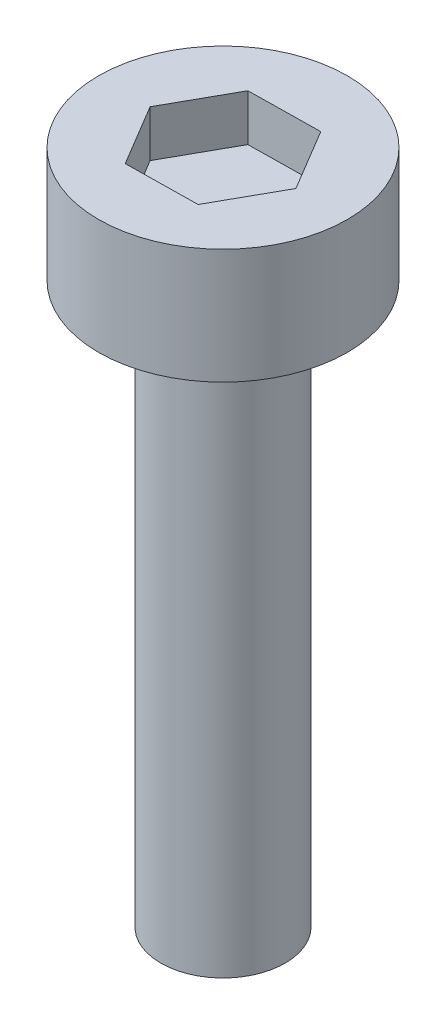
ISO-10303-21;
HEADER;
FILE_DESCRIPTION(('STEP AP214'),'2;1');
FILE_NAME('part.step','',(''),(''),'','','');
FILE_SCHEMA(('AUTOMOTIVE_DESIGN { 1 0 10303 214 1 1 1 1 }'));
ENDSEC;
DATA;
#1=APPLICATION_CONTEXT('core data for automotive mechanical design processes');
#2=APPLICATION_PROTOCOL_DEFINITION('international standard','automotive_design',2000,#1);
#3=PRODUCT_CONTEXT('',#1,'mechanical');
#4=PRODUCT('Part','Part','',(#3));
#5=PRODUCT_RELATED_PRODUCT_CATEGORY('part','',(#4));
#6=PRODUCT_DEFINITION_FORMATION('','',#4);
#7=PRODUCT_DEFINITION_CONTEXT('part definition',#1,'design');
#8=PRODUCT_DEFINITION('design','',#6,#7);
#9=PRODUCT_DEFINITION_SHAPE('','',#8);
#10=(LENGTH_UNIT() NAMED_UNIT(*) SI_UNIT(.MILLI.,.METRE.));
#11=(NAMED_UNIT(*) PLANE_ANGLE_UNIT() SI_UNIT($,.RADIAN.));
#12=(NAMED_UNIT(*) SI_UNIT($,.STERADIAN.) SOLID_ANGLE_UNIT());
#13=UNCERTAINTY_MEASURE_WITH_UNIT(LENGTH_MEASURE(1.E-05),#10,'distance_accuracy_value','');
#14=(GEOMETRIC_REPRESENTATION_CONTEXT(3) GLOBAL_UNCERTAINTY_ASSIGNED_CONTEXT((#13)) GLOBAL_UNIT_ASSIGNED_CONTEXT((#10,
#11,#12)) REPRESENTATION_CONTEXT('',''));
#15=CARTESIAN_POINT('',(0.,0.,0.));
#16=DIRECTION('',(0.,0.,1.));
#17=DIRECTION('',(1.,0.,0.));
#18=AXIS2_PLACEMENT_3D('',#15,#16,#17);
#19=CARTESIAN_POINT('',(0.,18.,0.));
#20=DIRECTION('',(0.,-1.,0.));
#21=DIRECTION('',(0.,0.,-1.));
#22=AXIS2_PLACEMENT_3D('',#19,#20,#21);
#23=CYLINDRICAL_SURFACE('',#22,2.);
#24=CARTESIAN_POINT('',(0.,18.,0.));
#25=DIRECTION('',(0.,1.,0.));
#26=DIRECTION('',(0.,0.,1.));
#27=AXIS2_PLACEMENT_3D('',#24,#25,#26);
#28=CIRCLE('',#27,2.);
#29=CARTESIAN_POINT('',(0.,18.,2.));
#30=VERTEX_POINT('',#29);
#31=EDGE_CURVE('E11',#30,#30,#28,.T.);
#32=ORIENTED_EDGE('',*,*,#31,.F.);
#33=EDGE_LOOP('',(#32));
#34=FACE_BOUND('',#33,.T.);
#35=CARTESIAN_POINT('',(0.,0.,0.));
#36=DIRECTION('',(0.,1.,0.));
#37=DIRECTION('',(0.,0.,1.));
#38=AXIS2_PLACEMENT_3D('',#35,#36,#37);
#39=CIRCLE('',#38,2.);
#40=CARTESIAN_POINT('',(0.,0.,2.));
#41=VERTEX_POINT('',#40);
#42=EDGE_CURVE('E24',#41,#41,#39,.T.);
#43=ORIENTED_EDGE('',*,*,#42,.T.);
#44=EDGE_LOOP('',(#43));
#45=FACE_BOUND('',#44,.T.);
#46=ADVANCED_FACE('F17',(#34,#45),#23,.T.);
#47=CARTESIAN_POINT('',(0.,0.,0.));
#48=DIRECTION('',(0.,1.,0.));
#49=DIRECTION('',(0.,0.,1.));
#50=AXIS2_PLACEMENT_3D('',#47,#48,#49);
#51=PLANE('',#50);
#52=ORIENTED_EDGE('',*,*,#42,.F.);
#53=EDGE_LOOP('',(#52));
#54=FACE_BOUND('',#53,.T.);
#55=ADVANCED_FACE('F132',(#54),#51,.F.);
#56=CARTESIAN_POINT('',(0.,21.7,0.));
#57=DIRECTION('',(0.,-1.,0.));
#58=DIRECTION('',(0.,0.,-1.));
#59=AXIS2_PLACEMENT_3D('',#56,#57,#58);
#60=CYLINDRICAL_SURFACE('',#59,4.);
#61=CARTESIAN_POINT('',(0.,21.7,0.));
#62=DIRECTION('',(0.,1.,0.));
#63=DIRECTION('',(0.,0.,1.));
#64=AXIS2_PLACEMENT_3D('',#61,#62,#63);
#65=CIRCLE('',#64,4.);
#66=CARTESIAN_POINT('',(0.,21.7,4.));
#67=VERTEX_POINT('',#66);
#68=EDGE_CURVE('E126',#67,#67,#65,.T.);
#69=ORIENTED_EDGE('',*,*,#68,.F.);
#70=EDGE_LOOP('',(#69));
#71=FACE_BOUND('',#70,.T.);
#72=CARTESIAN_POINT('',(0.,18.,0.));
#73=DIRECTION('',(0.,1.,0.));
#74=DIRECTION('',(0.,0.,1.));
#75=AXIS2_PLACEMENT_3D('',#72,#73,#74);
#76=CIRCLE('',#75,4.);
#77=CARTESIAN_POINT('',(0.,18.,4.));
#78=VERTEX_POINT('',#77);
#79=EDGE_CURVE('E123',#78,#78,#76,.T.);
#80=ORIENTED_EDGE('',*,*,#79,.T.);
#81=EDGE_LOOP('',(#80));
#82=FACE_BOUND('',#81,.T.);
#83=ADVANCED_FACE('F134',(#71,#82),#60,.T.);
#84=CARTESIAN_POINT('',(0.,21.7,0.));
#85=DIRECTION('',(0.,1.,0.));
#86=DIRECTION('',(0.,0.,1.));
#87=AXIS2_PLACEMENT_3D('',#84,#85,#86);
#88=PLANE('',#87);
#89=DIRECTION('',(0.999893086922528,0.,-0.0146224048821465));
#90=VECTOR('',#89,1.);
#91=CARTESIAN_POINT('',(-1.12533227602684,21.7,2.01667067263487));
#92=LINE('',#91,#90);
#93=CARTESIAN_POINT('',(-1.12533227602684,21.7,2.01667067263487));
#94=VERTEX_POINT('',#93);
#95=CARTESIAN_POINT('',(1.18382189555543,21.7,1.98290167505524));
#96=VERTEX_POINT('',#95);
#97=EDGE_CURVE('E31',#94,#96,#92,.T.);
#98=ORIENTED_EDGE('',*,*,#97,.F.);
#99=DIRECTION('',(0.512609917553624,0.,0.858621611902278));
#100=VECTOR('',#99,1.);
#101=CARTESIAN_POINT('',(-2.30915417158227,21.7,0.0337689975796269));
#102=LINE('',#101,#100);
#103=CARTESIAN_POINT('',(-2.30915417158227,21.7,0.0337689975796269));
#104=VERTEX_POINT('',#103);
#105=EDGE_CURVE('E36',#104,#94,#102,.T.);
#106=ORIENTED_EDGE('',*,*,#105,.F.);
#107=DIRECTION('',(-0.487283169368904,0.,0.873244016784424));
#108=VECTOR('',#107,1.);
#109=CARTESIAN_POINT('',(-1.18382189555543,21.7,-1.98290167505524));
#110=LINE('',#109,#108);
#111=CARTESIAN_POINT('',(-1.18382189555543,21.7,-1.98290167505524));
#112=VERTEX_POINT('',#111);
#113=EDGE_CURVE('E118',#112,#104,#110,.T.);
#114=ORIENTED_EDGE('',*,*,#113,.F.);
#115=DIRECTION('',(-0.999893086922528,0.,0.0146224048821459));
#116=VECTOR('',#115,1.);
#117=CARTESIAN_POINT('',(1.12533227602684,21.7,-2.01667067263487));
#118=LINE('',#117,#116);
#119=CARTESIAN_POINT('',(1.12533227602684,21.7,-2.01667067263487));
#120=VERTEX_POINT('',#119);
#121=EDGE_CURVE('E115',#120,#112,#118,.T.);
#122=ORIENTED_EDGE('',*,*,#121,.F.);
#123=DIRECTION('',(-0.512609917553624,0.,-0.858621611902278));
#124=VECTOR('',#123,1.);
#125=CARTESIAN_POINT('',(2.30915417158227,21.7,-0.0337689975796276));
#126=LINE('',#125,#124);
#127=CARTESIAN_POINT('',(2.30915417158227,21.7,-0.0337689975796276));
#128=VERTEX_POINT('',#127);
#129=EDGE_CURVE('E113',#128,#120,#126,.T.);
#130=ORIENTED_EDGE('',*,*,#129,.F.);
#131=DIRECTION('',(0.487283169368904,0.,-0.873244016784424));
#132=VECTOR('',#131,1.);
#133=CARTESIAN_POINT('',(1.18382189555543,21.7,1.98290167505524));
#134=LINE('',#133,#132);
#135=EDGE_CURVE('E87',#96,#128,#134,.T.);
#136=ORIENTED_EDGE('',*,*,#135,.F.);
#137=EDGE_LOOP('',(#98,#106,#114,#122,#130,#136));
#138=FACE_BOUND('',#137,.T.);
#139=ORIENTED_EDGE('',*,*,#68,.T.);
#140=EDGE_LOOP('',(#139));
#141=FACE_BOUND('',#140,.T.);
#142=ADVANCED_FACE('F140',(#138,#141),#88,.T.);
#143=CARTESIAN_POINT('',(0.,18.,0.));
#144=DIRECTION('',(0.,1.,0.));
#145=DIRECTION('',(0.,0.,1.));
#146=AXIS2_PLACEMENT_3D('',#143,#144,#145);
#147=PLANE('',#146);
#148=ORIENTED_EDGE('',*,*,#31,.T.);
#149=EDGE_LOOP('',(#148));
#150=FACE_BOUND('',#149,.T.);
#151=ORIENTED_EDGE('',*,*,#79,.F.);
#152=EDGE_LOOP('',(#151));
#153=FACE_BOUND('',#152,.T.);
#154=ADVANCED_FACE('F147',(#150,#153),#147,.F.);
#155=CARTESIAN_POINT('',(-1.12533227602684,20.2,2.01667067263487));
#156=DIRECTION('',(0.0146224048821465,0.,0.999893086922528));
#157=DIRECTION('',(0.999893086922528,0.,-0.0146224048821465));
#158=AXIS2_PLACEMENT_3D('',#155,#156,#157);
#159=PLANE('',#158);
#160=ORIENTED_EDGE('',*,*,#97,.T.);
#161=DIRECTION('',(0.,1.,0.));
#162=VECTOR('',#161,1.);
#163=CARTESIAN_POINT('',(1.18382189555543,20.2,1.98290167505524));
#164=LINE('',#163,#162);
#165=CARTESIAN_POINT('',(1.18382189555543,20.2,1.98290167505524));
#166=VERTEX_POINT('',#165);
#167=EDGE_CURVE('E110',#166,#96,#164,.T.);
#168=ORIENTED_EDGE('',*,*,#167,.F.);
#169=DIRECTION('',(0.999893086922528,0.,-0.0146224048821465));
#170=VECTOR('',#169,1.);
#171=CARTESIAN_POINT('',(-1.12533227602684,20.2,2.01667067263487));
#172=LINE('',#171,#170);
#173=CARTESIAN_POINT('',(-1.12533227602684,20.2,2.01667067263487));
#174=VERTEX_POINT('',#173);
#175=EDGE_CURVE('E91',#174,#166,#172,.T.);
#176=ORIENTED_EDGE('',*,*,#175,.F.);
#177=DIRECTION('',(0.,1.,0.));
#178=VECTOR('',#177,1.);
#179=CARTESIAN_POINT('',(-1.12533227602684,20.2,2.01667067263487));
#180=LINE('',#179,#178);
#181=EDGE_CURVE('E107',#174,#94,#180,.T.);
#182=ORIENTED_EDGE('',*,*,#181,.T.);
#183=EDGE_LOOP('',(#160,#168,#176,#182));
#184=FACE_BOUND('',#183,.T.);
#185=ADVANCED_FACE('F150',(#184),#159,.F.);
#186=CARTESIAN_POINT('',(-2.30915417158227,20.2,0.0337689975796269));
#187=DIRECTION('',(-0.858621611902278,0.,0.512609917553624));
#188=DIRECTION('',(0.512609917553624,0.,0.858621611902278));
#189=AXIS2_PLACEMENT_3D('',#186,#187,#188);
#190=PLANE('',#189);
#191=ORIENTED_EDGE('',*,*,#105,.T.);
#192=ORIENTED_EDGE('',*,*,#181,.F.);
#193=DIRECTION('',(0.512609917553624,0.,0.858621611902278));
#194=VECTOR('',#193,1.);
#195=CARTESIAN_POINT('',(-2.30915417158227,20.2,0.0337689975796269));
#196=LINE('',#195,#194);
#197=CARTESIAN_POINT('',(-2.30915417158227,20.2,0.0337689975796269));
#198=VERTEX_POINT('',#197);
#199=EDGE_CURVE('E105',#198,#174,#196,.T.);
#200=ORIENTED_EDGE('',*,*,#199,.F.);
#201=DIRECTION('',(0.,1.,0.));
#202=VECTOR('',#201,1.);
#203=CARTESIAN_POINT('',(-2.30915417158227,20.2,0.0337689975796269));
#204=LINE('',#203,#202);
#205=EDGE_CURVE('E103',#198,#104,#204,.T.);
#206=ORIENTED_EDGE('',*,*,#205,.T.);
#207=EDGE_LOOP('',(#191,#192,#200,#206));
#208=FACE_BOUND('',#207,.T.);
#209=ADVANCED_FACE('F154',(#208),#190,.F.);
#210=CARTESIAN_POINT('',(-1.18382189555543,20.2,-1.98290167505524));
#211=DIRECTION('',(-0.873244016784424,0.,-0.487283169368904));
#212=DIRECTION('',(-0.487283169368904,0.,0.873244016784424));
#213=AXIS2_PLACEMENT_3D('',#210,#211,#212);
#214=PLANE('',#213);
#215=ORIENTED_EDGE('',*,*,#113,.T.);
#216=ORIENTED_EDGE('',*,*,#205,.F.);
#217=DIRECTION('',(-0.487283169368904,0.,0.873244016784424));
#218=VECTOR('',#217,1.);
#219=CARTESIAN_POINT('',(-1.18382189555543,20.2,-1.98290167505524));
#220=LINE('',#219,#218);
#221=CARTESIAN_POINT('',(-1.18382189555543,20.2,-1.98290167505524));
#222=VERTEX_POINT('',#221);
#223=EDGE_CURVE('E100',#222,#198,#220,.T.);
#224=ORIENTED_EDGE('',*,*,#223,.F.);
#225=DIRECTION('',(0.,1.,0.));
#226=VECTOR('',#225,1.);
#227=CARTESIAN_POINT('',(-1.18382189555543,20.2,-1.98290167505524));
#228=LINE('',#227,#226);
#229=EDGE_CURVE('E97',#222,#112,#228,.T.);
#230=ORIENTED_EDGE('',*,*,#229,.T.);
#231=EDGE_LOOP('',(#215,#216,#224,#230));
#232=FACE_BOUND('',#231,.T.);
#233=ADVANCED_FACE('F158',(#232),#214,.F.);
#234=CARTESIAN_POINT('',(1.12533227602684,20.2,-2.01667067263487));
#235=DIRECTION('',(-0.0146224048821459,0.,-0.999893086922528));
#236=DIRECTION('',(-0.999893086922528,0.,0.0146224048821459));
#237=AXIS2_PLACEMENT_3D('',#234,#235,#236);
#238=PLANE('',#237);
#239=ORIENTED_EDGE('',*,*,#121,.T.);
#240=ORIENTED_EDGE('',*,*,#229,.F.);
#241=DIRECTION('',(-0.999893086922528,0.,0.0146224048821459));
#242=VECTOR('',#241,1.);
#243=CARTESIAN_POINT('',(1.12533227602684,20.2,-2.01667067263487));
#244=LINE('',#243,#242);
#245=CARTESIAN_POINT('',(1.12533227602684,20.2,-2.01667067263487));
#246=VERTEX_POINT('',#245);
#247=EDGE_CURVE('E95',#246,#222,#244,.T.);
#248=ORIENTED_EDGE('',*,*,#247,.F.);
#249=DIRECTION('',(0.,1.,0.));
#250=VECTOR('',#249,1.);
#251=CARTESIAN_POINT('',(1.12533227602684,20.2,-2.01667067263487));
#252=LINE('',#251,#250);
#253=EDGE_CURVE('E76',#246,#120,#252,.T.);
#254=ORIENTED_EDGE('',*,*,#253,.T.);
#255=EDGE_LOOP('',(#239,#240,#248,#254));
#256=FACE_BOUND('',#255,.T.);
#257=ADVANCED_FACE('F162',(#256),#238,.F.);
#258=CARTESIAN_POINT('',(2.30915417158227,20.2,-0.0337689975796276));
#259=DIRECTION('',(0.858621611902278,0.,-0.512609917553624));
#260=DIRECTION('',(-0.512609917553624,0.,-0.858621611902278));
#261=AXIS2_PLACEMENT_3D('',#258,#259,#260);
#262=PLANE('',#261);
#263=ORIENTED_EDGE('',*,*,#129,.T.);
#264=ORIENTED_EDGE('',*,*,#253,.F.);
#265=DIRECTION('',(-0.512609917553624,0.,-0.858621611902278));
#266=VECTOR('',#265,1.);
#267=CARTESIAN_POINT('',(2.30915417158227,20.2,-0.0337689975796276));
#268=LINE('',#267,#266);
#269=CARTESIAN_POINT('',(2.30915417158227,20.2,-0.0337689975796276));
#270=VERTEX_POINT('',#269);
#271=EDGE_CURVE('E69',#270,#246,#268,.T.);
#272=ORIENTED_EDGE('',*,*,#271,.F.);
#273=DIRECTION('',(0.,1.,0.));
#274=VECTOR('',#273,1.);
#275=CARTESIAN_POINT('',(2.30915417158227,20.2,-0.0337689975796276));
#276=LINE('',#275,#274);
#277=EDGE_CURVE('E73',#270,#128,#276,.T.);
#278=ORIENTED_EDGE('',*,*,#277,.T.);
#279=EDGE_LOOP('',(#263,#264,#272,#278));
#280=FACE_BOUND('',#279,.T.);
#281=ADVANCED_FACE('F72',(#280),#262,.F.);
#282=CARTESIAN_POINT('',(1.18382189555543,20.2,1.98290167505524));
#283=DIRECTION('',(0.873244016784424,0.,0.487283169368904));
#284=DIRECTION('',(0.487283169368904,0.,-0.873244016784425));
#285=AXIS2_PLACEMENT_3D('',#282,#283,#284);
#286=PLANE('',#285);
#287=ORIENTED_EDGE('',*,*,#135,.T.);
#288=ORIENTED_EDGE('',*,*,#277,.F.);
#289=DIRECTION('',(0.487283169368904,0.,-0.873244016784424));
#290=VECTOR('',#289,1.);
#291=CARTESIAN_POINT('',(1.18382189555543,20.2,1.98290167505524));
#292=LINE('',#291,#290);
#293=EDGE_CURVE('E85',#166,#270,#292,.T.);
#294=ORIENTED_EDGE('',*,*,#293,.F.);
#295=ORIENTED_EDGE('',*,*,#167,.T.);
#296=EDGE_LOOP('',(#287,#288,#294,#295));
#297=FACE_BOUND('',#296,.T.);
#298=ADVANCED_FACE('F83',(#297),#286,.F.);
#299=CARTESIAN_POINT('',(0.,20.2,0.));
#300=DIRECTION('',(0.,1.,0.));
#301=DIRECTION('',(0.,0.,1.));
#302=AXIS2_PLACEMENT_3D('',#299,#300,#301);
#303=PLANE('',#302);
#304=ORIENTED_EDGE('',*,*,#175,.T.);
#305=ORIENTED_EDGE('',*,*,#293,.T.);
#306=ORIENTED_EDGE('',*,*,#271,.T.);
#307=ORIENTED_EDGE('',*,*,#247,.T.);
#308=ORIENTED_EDGE('',*,*,#223,.T.);
#309=ORIENTED_EDGE('',*,*,#199,.T.);
#310=EDGE_LOOP('',(#304,#305,#306,#307,#308,#309));
#311=FACE_BOUND('',#310,.T.);
#312=ADVANCED_FACE('F89',(#311),#303,.T.);
#313=CLOSED_SHELL('',(#46,#55,#83,#142,#154,#185,#209,#233,#257,#281,#298,#312));
#314=MANIFOLD_SOLID_BREP('B1',#313);
#315=ADVANCED_BREP_SHAPE_REPRESENTATION('',(#18,#314),#14);
#316=SHAPE_DEFINITION_REPRESENTATION(#9,#315);
ENDSEC;
END-ISO-10303-21;
